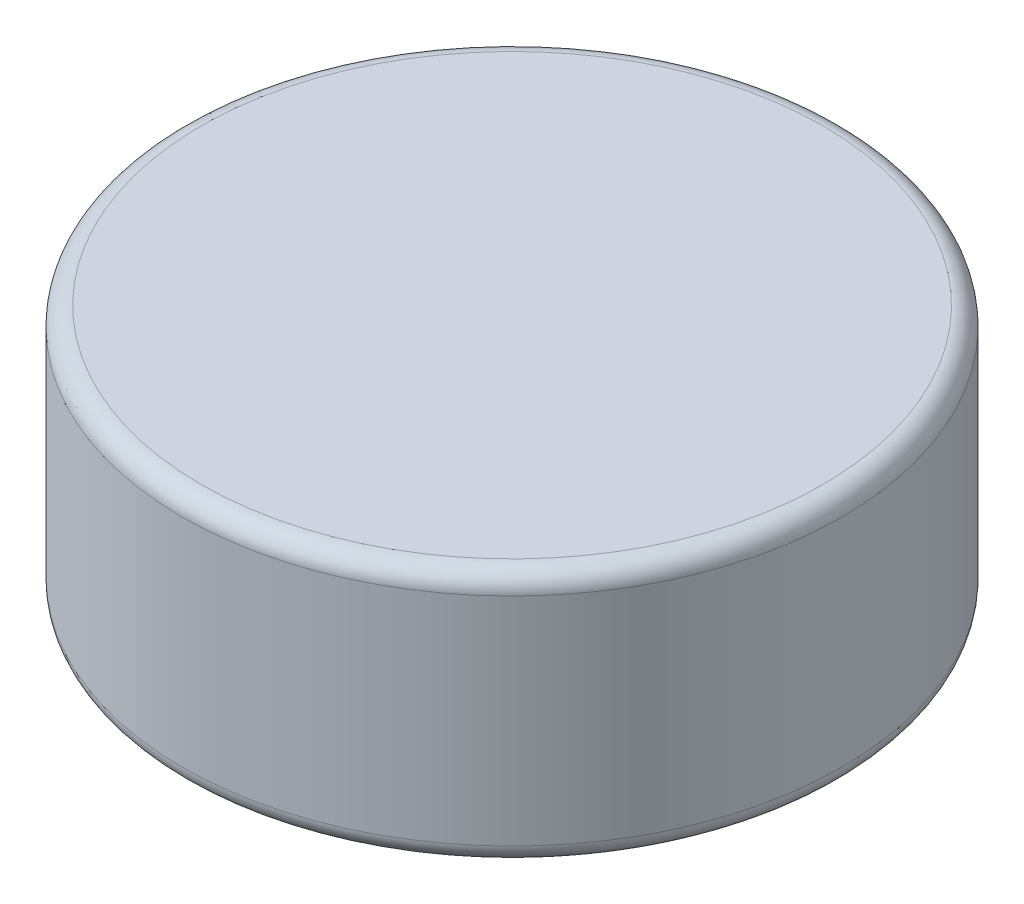
ISO-10303-21;
HEADER;
FILE_DESCRIPTION(('STEP AP214'),'2;1');
FILE_NAME('part.step','',(''),(''),'','','');
FILE_SCHEMA(('AUTOMOTIVE_DESIGN { 1 0 10303 214 1 1 1 1 }'));
ENDSEC;
DATA;
#1=APPLICATION_CONTEXT('core data for automotive mechanical design processes');
#2=APPLICATION_PROTOCOL_DEFINITION('international standard','automotive_design',2000,#1);
#3=PRODUCT_CONTEXT('',#1,'mechanical');
#4=PRODUCT('Part','Part','',(#3));
#5=PRODUCT_RELATED_PRODUCT_CATEGORY('part','',(#4));
#6=PRODUCT_DEFINITION_FORMATION('','',#4);
#7=PRODUCT_DEFINITION_CONTEXT('part definition',#1,'design');
#8=PRODUCT_DEFINITION('design','',#6,#7);
#9=PRODUCT_DEFINITION_SHAPE('','',#8);
#10=(LENGTH_UNIT() NAMED_UNIT(*) SI_UNIT(.MILLI.,.METRE.));
#11=(NAMED_UNIT(*) PLANE_ANGLE_UNIT() SI_UNIT($,.RADIAN.));
#12=(NAMED_UNIT(*) SI_UNIT($,.STERADIAN.) SOLID_ANGLE_UNIT());
#13=UNCERTAINTY_MEASURE_WITH_UNIT(LENGTH_MEASURE(1.E-05),#10,'distance_accuracy_value','');
#14=(GEOMETRIC_REPRESENTATION_CONTEXT(3) GLOBAL_UNCERTAINTY_ASSIGNED_CONTEXT((#13)) GLOBAL_UNIT_ASSIGNED_CONTEXT((#10,
#11,#12)) REPRESENTATION_CONTEXT('',''));
#15=CARTESIAN_POINT('',(0.,0.,0.));
#16=DIRECTION('',(0.,0.,1.));
#17=DIRECTION('',(1.,0.,0.));
#18=AXIS2_PLACEMENT_3D('',#15,#16,#17);
#19=CARTESIAN_POINT('',(0.,27.,0.));
#20=DIRECTION('',(0.,-1.,0.));
#21=DIRECTION('',(0.,0.,-1.));
#22=AXIS2_PLACEMENT_3D('',#19,#20,#21);
#23=CYLINDRICAL_SURFACE('',#22,35.);
#24=CARTESIAN_POINT('',(0.,2.,0.));
#25=DIRECTION('',(0.,1.,0.));
#26=DIRECTION('',(0.,0.,1.));
#27=AXIS2_PLACEMENT_3D('',#24,#25,#26);
#28=CIRCLE('',#27,35.);
#29=CARTESIAN_POINT('',(0.,2.,35.));
#30=VERTEX_POINT('',#29);
#31=EDGE_CURVE('E49',#30,#30,#28,.T.);
#32=ORIENTED_EDGE('',*,*,#31,.T.);
#33=EDGE_LOOP('',(#32));
#34=FACE_BOUND('',#33,.T.);
#35=CARTESIAN_POINT('',(0.,25.,0.));
#36=DIRECTION('',(0.,1.,0.));
#37=DIRECTION('',(0.,0.,1.));
#38=AXIS2_PLACEMENT_3D('',#35,#36,#37);
#39=CIRCLE('',#38,35.);
#40=CARTESIAN_POINT('',(0.,25.,35.));
#41=VERTEX_POINT('',#40);
#42=EDGE_CURVE('E54',#41,#41,#39,.F.);
#43=ORIENTED_EDGE('',*,*,#42,.T.);
#44=EDGE_LOOP('',(#43));
#45=FACE_BOUND('',#44,.T.);
#46=ADVANCED_FACE('F34',(#34,#45),#23,.T.);
#47=CARTESIAN_POINT('',(0.,27.,0.));
#48=DIRECTION('',(0.,1.,0.));
#49=DIRECTION('',(0.,0.,1.));
#50=AXIS2_PLACEMENT_3D('',#47,#48,#49);
#51=PLANE('',#50);
#52=CARTESIAN_POINT('',(0.,27.,0.));
#53=DIRECTION('',(0.,1.,0.));
#54=DIRECTION('',(0.,0.,1.));
#55=AXIS2_PLACEMENT_3D('',#52,#53,#54);
#56=CIRCLE('',#55,33.);
#57=CARTESIAN_POINT('',(0.,27.,33.));
#58=VERTEX_POINT('',#57);
#59=EDGE_CURVE('E41',#58,#58,#56,.T.);
#60=ORIENTED_EDGE('',*,*,#59,.T.);
#61=EDGE_LOOP('',(#60));
#62=FACE_BOUND('',#61,.T.);
#63=ADVANCED_FACE('F91',(#62),#51,.T.);
#64=CARTESIAN_POINT('',(0.,0.,0.));
#65=DIRECTION('',(0.,1.,0.));
#66=DIRECTION('',(0.,0.,1.));
#67=AXIS2_PLACEMENT_3D('',#64,#65,#66);
#68=PLANE('',#67);
#69=CARTESIAN_POINT('',(0.,0.,0.));
#70=DIRECTION('',(0.,1.,0.));
#71=DIRECTION('',(0.,0.,1.));
#72=AXIS2_PLACEMENT_3D('',#69,#70,#71);
#73=CIRCLE('',#72,5.75);
#74=CARTESIAN_POINT('',(0.,0.,5.75));
#75=VERTEX_POINT('',#74);
#76=EDGE_CURVE('E10',#75,#75,#73,.F.);
#77=ORIENTED_EDGE('',*,*,#76,.F.);
#78=EDGE_LOOP('',(#77));
#79=FACE_BOUND('',#78,.T.);
#80=CARTESIAN_POINT('',(0.,0.,0.));
#81=DIRECTION('',(0.,1.,0.));
#82=DIRECTION('',(0.,0.,1.));
#83=AXIS2_PLACEMENT_3D('',#80,#81,#82);
#84=CIRCLE('',#83,33.);
#85=CARTESIAN_POINT('',(0.,0.,33.));
#86=VERTEX_POINT('',#85);
#87=EDGE_CURVE('E45',#86,#86,#84,.F.);
#88=ORIENTED_EDGE('',*,*,#87,.T.);
#89=EDGE_LOOP('',(#88));
#90=FACE_BOUND('',#89,.T.);
#91=ADVANCED_FACE('F97',(#79,#90),#68,.F.);
#92=CARTESIAN_POINT('',(0.,2.,0.));
#93=DIRECTION('',(0.,1.,0.));
#94=DIRECTION('',(0.,0.,1.));
#95=AXIS2_PLACEMENT_3D('',#92,#93,#94);
#96=TOROIDAL_SURFACE('',#95,33.,2.);
#97=ORIENTED_EDGE('',*,*,#87,.F.);
#98=EDGE_LOOP('',(#97));
#99=FACE_BOUND('',#98,.T.);
#100=ORIENTED_EDGE('',*,*,#31,.F.);
#101=EDGE_LOOP('',(#100));
#102=FACE_BOUND('',#101,.T.);
#103=ADVANCED_FACE('F87',(#99,#102),#96,.T.);
#104=CARTESIAN_POINT('',(0.,25.,0.));
#105=DIRECTION('',(0.,1.,0.));
#106=DIRECTION('',(0.,0.,1.));
#107=AXIS2_PLACEMENT_3D('',#104,#105,#106);
#108=TOROIDAL_SURFACE('',#107,33.,2.);
#109=ORIENTED_EDGE('',*,*,#42,.F.);
#110=EDGE_LOOP('',(#109));
#111=FACE_BOUND('',#110,.T.);
#112=ORIENTED_EDGE('',*,*,#59,.F.);
#113=EDGE_LOOP('',(#112));
#114=FACE_BOUND('',#113,.T.);
#115=ADVANCED_FACE('F36',(#111,#114),#108,.T.);
#116=CARTESIAN_POINT('',(0.,-2.,0.));
#117=DIRECTION('',(0.,1.,0.));
#118=DIRECTION('',(0.,0.,1.));
#119=AXIS2_PLACEMENT_3D('',#116,#117,#118);
#120=CYLINDRICAL_SURFACE('',#119,5.75);
#121=CARTESIAN_POINT('',(0.,-2.,0.));
#122=DIRECTION('',(0.,-1.,0.));
#123=DIRECTION('',(0.,0.,-1.));
#124=AXIS2_PLACEMENT_3D('',#121,#122,#123);
#125=CIRCLE('',#124,5.75);
#126=CARTESIAN_POINT('',(0.,-2.,-5.75));
#127=VERTEX_POINT('',#126);
#128=EDGE_CURVE('E57',#127,#127,#125,.T.);
#129=ORIENTED_EDGE('',*,*,#128,.F.);
#130=EDGE_LOOP('',(#129));
#131=FACE_BOUND('',#130,.T.);
#132=ORIENTED_EDGE('',*,*,#76,.T.);
#133=EDGE_LOOP('',(#132));
#134=FACE_BOUND('',#133,.T.);
#135=ADVANCED_FACE('F78',(#131,#134),#120,.T.);
#136=CARTESIAN_POINT('',(0.,-2.,0.));
#137=DIRECTION('',(0.,-1.,0.));
#138=DIRECTION('',(0.,0.,-1.));
#139=AXIS2_PLACEMENT_3D('',#136,#137,#138);
#140=PLANE('',#139);
#141=CARTESIAN_POINT('',(0.,-2.,0.));
#142=DIRECTION('',(0.,-1.,0.));
#143=DIRECTION('',(0.,0.,-1.));
#144=AXIS2_PLACEMENT_3D('',#141,#142,#143);
#145=CIRCLE('',#144,3.);
#146=CARTESIAN_POINT('',(0.,-2.,-3.));
#147=VERTEX_POINT('',#146);
#148=EDGE_CURVE('E61',#147,#147,#145,.T.);
#149=ORIENTED_EDGE('',*,*,#148,.F.);
#150=EDGE_LOOP('',(#149));
#151=FACE_BOUND('',#150,.T.);
#152=ORIENTED_EDGE('',*,*,#128,.T.);
#153=EDGE_LOOP('',(#152));
#154=FACE_BOUND('',#153,.T.);
#155=ADVANCED_FACE('F72',(#151,#154),#140,.T.);
#156=CARTESIAN_POINT('',(0.,3.,0.));
#157=DIRECTION('',(0.,-1.,0.));
#158=DIRECTION('',(0.,0.,-1.));
#159=AXIS2_PLACEMENT_3D('',#156,#157,#158);
#160=CYLINDRICAL_SURFACE('',#159,3.);
#161=CARTESIAN_POINT('',(0.,3.,0.));
#162=DIRECTION('',(0.,-1.,0.));
#163=DIRECTION('',(0.,0.,-1.));
#164=AXIS2_PLACEMENT_3D('',#161,#162,#163);
#165=CIRCLE('',#164,3.);
#166=CARTESIAN_POINT('',(0.,3.,-3.));
#167=VERTEX_POINT('',#166);
#168=EDGE_CURVE('E60',#167,#167,#165,.T.);
#169=ORIENTED_EDGE('',*,*,#168,.F.);
#170=EDGE_LOOP('',(#169));
#171=FACE_BOUND('',#170,.T.);
#172=ORIENTED_EDGE('',*,*,#148,.T.);
#173=EDGE_LOOP('',(#172));
#174=FACE_BOUND('',#173,.T.);
#175=ADVANCED_FACE('F69',(#171,#174),#160,.F.);
#176=CARTESIAN_POINT('',(0.,3.,0.));
#177=DIRECTION('',(0.,-1.,0.));
#178=DIRECTION('',(0.,0.,-1.));
#179=AXIS2_PLACEMENT_3D('',#176,#177,#178);
#180=PLANE('',#179);
#181=ORIENTED_EDGE('',*,*,#168,.T.);
#182=EDGE_LOOP('',(#181));
#183=FACE_BOUND('',#182,.T.);
#184=ADVANCED_FACE('F67',(#183),#180,.T.);
#185=CLOSED_SHELL('',(#46,#63,#91,#103,#115,#135,#155,#175,#184));
#186=MANIFOLD_SOLID_BREP('B2',#185);
#187=ADVANCED_BREP_SHAPE_REPRESENTATION('',(#18,#186),#14);
#188=SHAPE_DEFINITION_REPRESENTATION(#9,#187);
ENDSEC;
END-ISO-10303-21;
